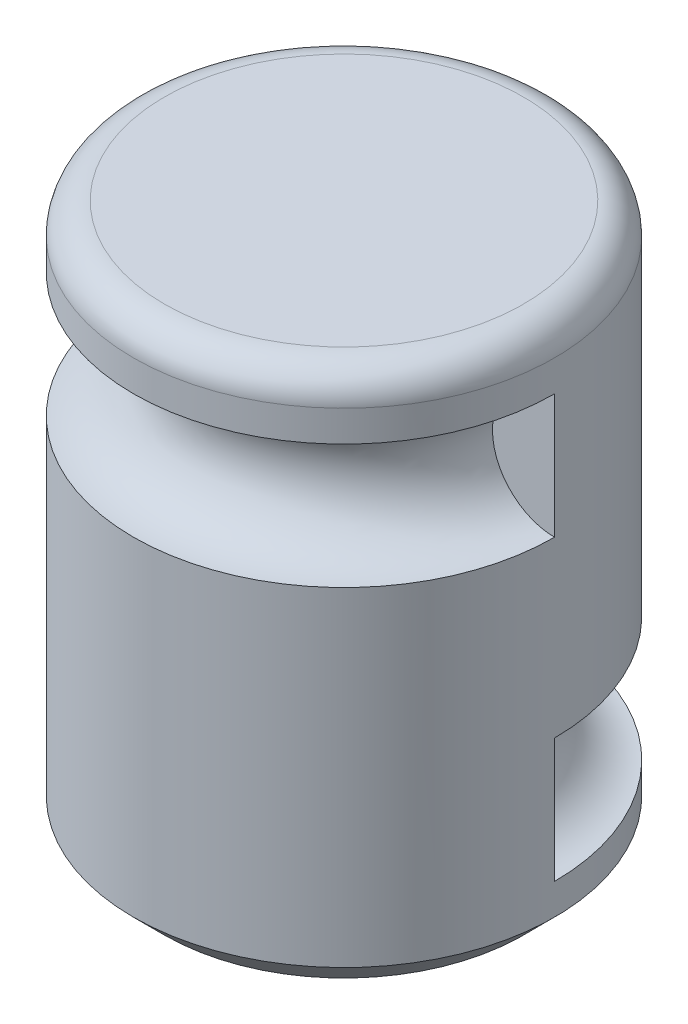
ISO-10303-21;
HEADER;
FILE_DESCRIPTION(('STEP AP214'),'2;1');
FILE_NAME('part.step','',(''),(''),'','','');
FILE_SCHEMA(('AUTOMOTIVE_DESIGN { 1 0 10303 214 1 1 1 1 }'));
ENDSEC;
DATA;
#1=APPLICATION_CONTEXT('core data for automotive mechanical design processes');
#2=APPLICATION_PROTOCOL_DEFINITION('international standard','automotive_design',2000,#1);
#3=PRODUCT_CONTEXT('',#1,'mechanical');
#4=PRODUCT('Part','Part','',(#3));
#5=PRODUCT_RELATED_PRODUCT_CATEGORY('part','',(#4));
#6=PRODUCT_DEFINITION_FORMATION('','',#4);
#7=PRODUCT_DEFINITION_CONTEXT('part definition',#1,'design');
#8=PRODUCT_DEFINITION('design','',#6,#7);
#9=PRODUCT_DEFINITION_SHAPE('','',#8);
#10=(LENGTH_UNIT() NAMED_UNIT(*) SI_UNIT(.MILLI.,.METRE.));
#11=(NAMED_UNIT(*) PLANE_ANGLE_UNIT() SI_UNIT($,.RADIAN.));
#12=(NAMED_UNIT(*) SI_UNIT($,.STERADIAN.) SOLID_ANGLE_UNIT());
#13=UNCERTAINTY_MEASURE_WITH_UNIT(LENGTH_MEASURE(1.E-05),#10,'distance_accuracy_value','');
#14=(GEOMETRIC_REPRESENTATION_CONTEXT(3) GLOBAL_UNCERTAINTY_ASSIGNED_CONTEXT((#13)) GLOBAL_UNIT_ASSIGNED_CONTEXT((#10,
#11,#12)) REPRESENTATION_CONTEXT('',''));
#15=CARTESIAN_POINT('',(0.,0.,0.));
#16=DIRECTION('',(0.,0.,1.));
#17=DIRECTION('',(1.,0.,0.));
#18=AXIS2_PLACEMENT_3D('',#15,#16,#17);
#19=CARTESIAN_POINT('',(0.,88.,0.));
#20=DIRECTION('',(0.,-1.,0.));
#21=DIRECTION('',(0.,0.,-1.));
#22=AXIS2_PLACEMENT_3D('',#19,#20,#21);
#23=CYLINDRICAL_SURFACE('',#22,33.9054250594901);
#24=CARTESIAN_POINT('',(0.,5.,0.));
#25=DIRECTION('',(0.,1.,0.));
#26=DIRECTION('',(0.,0.,1.));
#27=AXIS2_PLACEMENT_3D('',#24,#25,#26);
#28=CIRCLE('',#27,33.9054250594901);
#29=CARTESIAN_POINT('',(0.,5.,33.9054250594901));
#30=VERTEX_POINT('',#29);
#31=EDGE_CURVE('E60',#30,#30,#28,.T.);
#32=ORIENTED_EDGE('',*,*,#31,.T.);
#33=EDGE_LOOP('',(#32));
#34=FACE_BOUND('',#33,.T.);
#35=CARTESIAN_POINT('',(0.,83.,0.));
#36=DIRECTION('',(0.,1.,0.));
#37=DIRECTION('',(0.,0.,1.));
#38=AXIS2_PLACEMENT_3D('',#35,#36,#37);
#39=CIRCLE('',#38,33.9054250594901);
#40=CARTESIAN_POINT('',(0.,83.,33.9054250594901));
#41=VERTEX_POINT('',#40);
#42=EDGE_CURVE('E131',#41,#41,#39,.F.);
#43=ORIENTED_EDGE('',*,*,#42,.T.);
#44=EDGE_LOOP('',(#43));
#45=FACE_BOUND('',#44,.T.);
#46=CARTESIAN_POINT('',(0.,58.,0.));
#47=DIRECTION('',(0.,1.,0.));
#48=DIRECTION('',(0.,0.,1.));
#49=AXIS2_PLACEMENT_3D('',#46,#47,#48);
#50=CIRCLE('',#49,33.9054250594901);
#51=CARTESIAN_POINT('',(-33.9054250594901,58.,-2.36760317761508E-13));
#52=VERTEX_POINT('',#51);
#53=CARTESIAN_POINT('',(33.9054250594901,58.,0.));
#54=VERTEX_POINT('',#53);
#55=EDGE_CURVE('E117',#52,#54,#50,.T.);
#56=ORIENTED_EDGE('',*,*,#55,.F.);
#57=DIRECTION('',(0.,-1.,0.));
#58=VECTOR('',#57,1.);
#59=CARTESIAN_POINT('',(-33.9054250594901,88.,-2.36760317761508E-13));
#60=LINE('',#59,#58);
#61=CARTESIAN_POINT('',(-33.9054250594901,78.,-2.36760317761508E-13));
#62=VERTEX_POINT('',#61);
#63=EDGE_CURVE('E125',#52,#62,#60,.F.);
#64=ORIENTED_EDGE('',*,*,#63,.T.);
#65=CARTESIAN_POINT('',(0.,78.,0.));
#66=DIRECTION('',(0.,-1.,0.));
#67=DIRECTION('',(0.,0.,-1.));
#68=AXIS2_PLACEMENT_3D('',#65,#66,#67);
#69=CIRCLE('',#68,33.9054250594901);
#70=CARTESIAN_POINT('',(33.9054250594901,78.,0.));
#71=VERTEX_POINT('',#70);
#72=EDGE_CURVE('E120',#71,#62,#69,.T.);
#73=ORIENTED_EDGE('',*,*,#72,.F.);
#74=DIRECTION('',(0.,-1.,0.));
#75=VECTOR('',#74,1.);
#76=CARTESIAN_POINT('',(33.9054250594901,88.,0.));
#77=LINE('',#76,#75);
#78=EDGE_CURVE('E112',#54,#71,#77,.F.);
#79=ORIENTED_EDGE('',*,*,#78,.F.);
#80=EDGE_LOOP('',(#56,#64,#73,#79));
#81=FACE_BOUND('',#80,.T.);
#82=DIRECTION('',(0.,-1.,0.));
#83=VECTOR('',#82,1.);
#84=CARTESIAN_POINT('',(33.9054250594901,88.,2.36760317761508E-13));
#85=LINE('',#84,#83);
#86=CARTESIAN_POINT('',(33.9054250594901,30.,2.36760317761508E-13));
#87=VERTEX_POINT('',#86);
#88=CARTESIAN_POINT('',(33.9054250594901,10.,2.36760317761508E-13));
#89=VERTEX_POINT('',#88);
#90=EDGE_CURVE('E106',#87,#89,#85,.T.);
#91=ORIENTED_EDGE('',*,*,#90,.F.);
#92=CARTESIAN_POINT('',(0.,30.,0.));
#93=DIRECTION('',(0.,-1.,0.));
#94=DIRECTION('',(0.,0.,-1.));
#95=AXIS2_PLACEMENT_3D('',#92,#93,#94);
#96=CIRCLE('',#95,33.9054250594901);
#97=CARTESIAN_POINT('',(-33.9054250594901,30.,0.));
#98=VERTEX_POINT('',#97);
#99=EDGE_CURVE('E99',#87,#98,#96,.F.);
#100=ORIENTED_EDGE('',*,*,#99,.T.);
#101=DIRECTION('',(0.,-1.,0.));
#102=VECTOR('',#101,1.);
#103=CARTESIAN_POINT('',(-33.9054250594901,88.,0.));
#104=LINE('',#103,#102);
#105=CARTESIAN_POINT('',(-33.9054250594901,10.,0.));
#106=VERTEX_POINT('',#105);
#107=EDGE_CURVE('E86',#98,#106,#104,.T.);
#108=ORIENTED_EDGE('',*,*,#107,.T.);
#109=CARTESIAN_POINT('',(0.,10.,0.));
#110=DIRECTION('',(0.,1.,0.));
#111=DIRECTION('',(0.,0.,1.));
#112=AXIS2_PLACEMENT_3D('',#109,#110,#111);
#113=CIRCLE('',#112,33.9054250594901);
#114=EDGE_CURVE('E94',#106,#89,#113,.F.);
#115=ORIENTED_EDGE('',*,*,#114,.T.);
#116=EDGE_LOOP('',(#91,#100,#108,#115));
#117=FACE_BOUND('',#116,.T.);
#118=ADVANCED_FACE('F50',(#34,#45,#81,#117),#23,.T.);
#119=CARTESIAN_POINT('',(0.,88.,0.));
#120=DIRECTION('',(0.,1.,0.));
#121=DIRECTION('',(0.,0.,1.));
#122=AXIS2_PLACEMENT_3D('',#119,#120,#121);
#123=PLANE('',#122);
#124=CARTESIAN_POINT('',(0.,88.,0.));
#125=DIRECTION('',(0.,1.,0.));
#126=DIRECTION('',(0.,0.,1.));
#127=AXIS2_PLACEMENT_3D('',#124,#125,#126);
#128=CIRCLE('',#127,28.9054250594901);
#129=CARTESIAN_POINT('',(0.,88.,28.9054250594901));
#130=VERTEX_POINT('',#129);
#131=EDGE_CURVE('E130',#130,#130,#128,.T.);
#132=ORIENTED_EDGE('',*,*,#131,.T.);
#133=EDGE_LOOP('',(#132));
#134=FACE_BOUND('',#133,.T.);
#135=ADVANCED_FACE('F151',(#134),#123,.T.);
#136=CARTESIAN_POINT('',(0.,0.,0.));
#137=DIRECTION('',(0.,1.,0.));
#138=DIRECTION('',(0.,0.,1.));
#139=AXIS2_PLACEMENT_3D('',#136,#137,#138);
#140=PLANE('',#139);
#141=CARTESIAN_POINT('',(0.,0.,0.));
#142=DIRECTION('',(0.,1.,0.));
#143=DIRECTION('',(0.,0.,1.));
#144=AXIS2_PLACEMENT_3D('',#141,#142,#143);
#145=CIRCLE('',#144,28.9054250594901);
#146=CARTESIAN_POINT('',(0.,0.,28.9054250594901));
#147=VERTEX_POINT('',#146);
#148=EDGE_CURVE('E11',#147,#147,#145,.F.);
#149=ORIENTED_EDGE('',*,*,#148,.T.);
#150=EDGE_LOOP('',(#149));
#151=FACE_BOUND('',#150,.T.);
#152=ADVANCED_FACE('F156',(#151),#140,.F.);
#153=CARTESIAN_POINT('',(0.,20.,0.));
#154=DIRECTION('',(0.,1.,0.));
#155=DIRECTION('',(0.,0.,1.));
#156=AXIS2_PLACEMENT_3D('',#153,#154,#155);
#157=TOROIDAL_SURFACE('',#156,33.9054250594901,10.);
#158=CARTESIAN_POINT('',(33.9054250594901,20.,2.36760317761508E-13));
#159=DIRECTION('',(0.,0.,-1.));
#160=DIRECTION('',(-1.,0.,0.));
#161=AXIS2_PLACEMENT_3D('',#158,#159,#160);
#162=CIRCLE('',#161,10.);
#163=EDGE_CURVE('E103',#89,#87,#162,.T.);
#164=ORIENTED_EDGE('',*,*,#163,.F.);
#165=ORIENTED_EDGE('',*,*,#114,.F.);
#166=CARTESIAN_POINT('',(-33.9054250594901,20.,0.));
#167=DIRECTION('',(0.,0.,1.));
#168=DIRECTION('',(1.,0.,0.));
#169=AXIS2_PLACEMENT_3D('',#166,#167,#168);
#170=CIRCLE('',#169,10.);
#171=EDGE_CURVE('E68',#106,#98,#170,.T.);
#172=ORIENTED_EDGE('',*,*,#171,.T.);
#173=ORIENTED_EDGE('',*,*,#99,.F.);
#174=EDGE_LOOP('',(#164,#165,#172,#173));
#175=FACE_BOUND('',#174,.T.);
#176=ADVANCED_FACE('F97',(#175),#157,.F.);
#177=CARTESIAN_POINT('',(33.9054250594901,20.,2.36760317761508E-13));
#178=DIRECTION('',(0.,0.,-1.));
#179=DIRECTION('',(-1.,0.,0.));
#180=AXIS2_PLACEMENT_3D('',#177,#178,#179);
#181=PLANE('',#180);
#182=ORIENTED_EDGE('',*,*,#90,.T.);
#183=ORIENTED_EDGE('',*,*,#163,.T.);
#184=EDGE_LOOP('',(#182,#183));
#185=FACE_BOUND('',#184,.T.);
#186=ADVANCED_FACE('F163',(#185),#181,.T.);
#187=CARTESIAN_POINT('',(-33.9054250594901,20.,0.));
#188=DIRECTION('',(0.,0.,1.));
#189=DIRECTION('',(1.,0.,0.));
#190=AXIS2_PLACEMENT_3D('',#187,#188,#189);
#191=PLANE('',#190);
#192=ORIENTED_EDGE('',*,*,#171,.F.);
#193=ORIENTED_EDGE('',*,*,#107,.F.);
#194=EDGE_LOOP('',(#192,#193));
#195=FACE_BOUND('',#194,.T.);
#196=ADVANCED_FACE('F90',(#195),#191,.F.);
#197=CARTESIAN_POINT('',(0.,68.,0.));
#198=DIRECTION('',(0.,1.,0.));
#199=DIRECTION('',(0.,0.,1.));
#200=AXIS2_PLACEMENT_3D('',#197,#198,#199);
#201=TOROIDAL_SURFACE('',#200,33.9054250594901,10.);
#202=ORIENTED_EDGE('',*,*,#72,.T.);
#203=CARTESIAN_POINT('',(-33.9054250594901,68.,-2.36760317761508E-13));
#204=DIRECTION('',(0.,0.,-1.));
#205=DIRECTION('',(-1.,0.,0.));
#206=AXIS2_PLACEMENT_3D('',#203,#204,#205);
#207=CIRCLE('',#206,10.);
#208=EDGE_CURVE('E92',#62,#52,#207,.T.);
#209=ORIENTED_EDGE('',*,*,#208,.T.);
#210=ORIENTED_EDGE('',*,*,#55,.T.);
#211=CARTESIAN_POINT('',(33.9054250594901,68.,0.));
#212=DIRECTION('',(0.,0.,1.));
#213=DIRECTION('',(1.,0.,0.));
#214=AXIS2_PLACEMENT_3D('',#211,#212,#213);
#215=CIRCLE('',#214,10.);
#216=EDGE_CURVE('E64',#71,#54,#215,.T.);
#217=ORIENTED_EDGE('',*,*,#216,.F.);
#218=EDGE_LOOP('',(#202,#209,#210,#217));
#219=FACE_BOUND('',#218,.T.);
#220=ADVANCED_FACE('F168',(#219),#201,.F.);
#221=CARTESIAN_POINT('',(-33.9054250594901,68.,-2.36760317761508E-13));
#222=DIRECTION('',(0.,0.,-1.));
#223=DIRECTION('',(-1.,0.,0.));
#224=AXIS2_PLACEMENT_3D('',#221,#222,#223);
#225=PLANE('',#224);
#226=ORIENTED_EDGE('',*,*,#208,.F.);
#227=ORIENTED_EDGE('',*,*,#63,.F.);
#228=EDGE_LOOP('',(#226,#227));
#229=FACE_BOUND('',#228,.T.);
#230=ADVANCED_FACE('F174',(#229),#225,.F.);
#231=CARTESIAN_POINT('',(33.9054250594901,68.,0.));
#232=DIRECTION('',(0.,0.,1.));
#233=DIRECTION('',(1.,0.,0.));
#234=AXIS2_PLACEMENT_3D('',#231,#232,#233);
#235=PLANE('',#234);
#236=ORIENTED_EDGE('',*,*,#78,.T.);
#237=ORIENTED_EDGE('',*,*,#216,.T.);
#238=EDGE_LOOP('',(#236,#237));
#239=FACE_BOUND('',#238,.T.);
#240=ADVANCED_FACE('F150',(#239),#235,.T.);
#241=CARTESIAN_POINT('',(0.,83.,0.));
#242=DIRECTION('',(0.,1.,0.));
#243=DIRECTION('',(0.,0.,1.));
#244=AXIS2_PLACEMENT_3D('',#241,#242,#243);
#245=TOROIDAL_SURFACE('',#244,28.9054250594901,5.);
#246=ORIENTED_EDGE('',*,*,#42,.F.);
#247=EDGE_LOOP('',(#246));
#248=FACE_BOUND('',#247,.T.);
#249=ORIENTED_EDGE('',*,*,#131,.F.);
#250=EDGE_LOOP('',(#249));
#251=FACE_BOUND('',#250,.T.);
#252=ADVANCED_FACE('F143',(#248,#251),#245,.T.);
#253=CARTESIAN_POINT('',(0.,5.,0.));
#254=DIRECTION('',(0.,1.,0.));
#255=DIRECTION('',(0.,0.,1.));
#256=AXIS2_PLACEMENT_3D('',#253,#254,#255);
#257=CONICAL_SURFACE('',#256,33.9054250594901,0.78539816339745);
#258=ORIENTED_EDGE('',*,*,#148,.F.);
#259=EDGE_LOOP('',(#258));
#260=FACE_BOUND('',#259,.T.);
#261=ORIENTED_EDGE('',*,*,#31,.F.);
#262=EDGE_LOOP('',(#261));
#263=FACE_BOUND('',#262,.T.);
#264=ADVANCED_FACE('F49',(#260,#263),#257,.T.);
#265=CLOSED_SHELL('',(#118,#135,#152,#176,#186,#196,#220,#230,#240,#252,#264));
#266=MANIFOLD_SOLID_BREP('B2',#265);
#267=ADVANCED_BREP_SHAPE_REPRESENTATION('',(#18,#266),#14);
#268=SHAPE_DEFINITION_REPRESENTATION(#9,#267);
ENDSEC;
END-ISO-10303-21;
